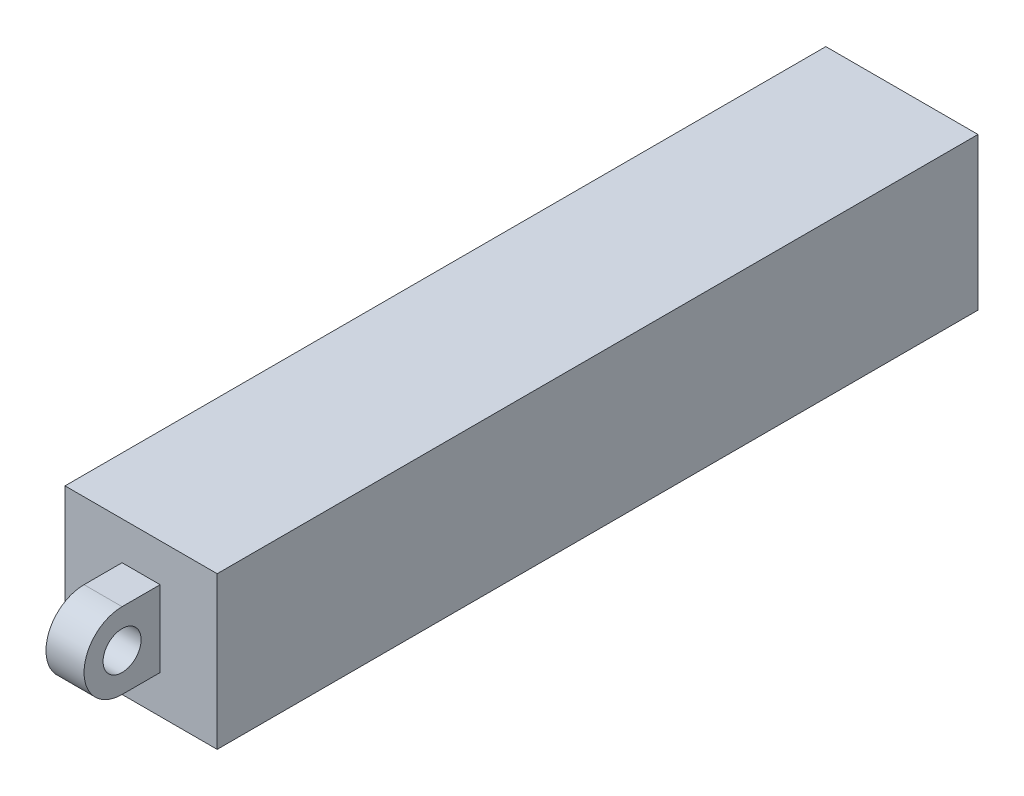
ISO-10303-21;
HEADER;
FILE_DESCRIPTION(('STEP AP214'),'2;1');
FILE_NAME('part.step','',(''),(''),'','','');
FILE_SCHEMA(('AUTOMOTIVE_DESIGN { 1 0 10303 214 1 1 1 1 }'));
ENDSEC;
DATA;
#1=APPLICATION_CONTEXT('core data for automotive mechanical design processes');
#2=APPLICATION_PROTOCOL_DEFINITION('international standard','automotive_design',2000,#1);
#3=PRODUCT_CONTEXT('',#1,'mechanical');
#4=PRODUCT('Part','Part','',(#3));
#5=PRODUCT_RELATED_PRODUCT_CATEGORY('part','',(#4));
#6=PRODUCT_DEFINITION_FORMATION('','',#4);
#7=PRODUCT_DEFINITION_CONTEXT('part definition',#1,'design');
#8=PRODUCT_DEFINITION('design','',#6,#7);
#9=PRODUCT_DEFINITION_SHAPE('','',#8);
#10=(LENGTH_UNIT() NAMED_UNIT(*) SI_UNIT(.MILLI.,.METRE.));
#11=(NAMED_UNIT(*) PLANE_ANGLE_UNIT() SI_UNIT($,.RADIAN.));
#12=(NAMED_UNIT(*) SI_UNIT($,.STERADIAN.) SOLID_ANGLE_UNIT());
#13=UNCERTAINTY_MEASURE_WITH_UNIT(LENGTH_MEASURE(1.E-05),#10,'distance_accuracy_value','');
#14=(GEOMETRIC_REPRESENTATION_CONTEXT(3) GLOBAL_UNCERTAINTY_ASSIGNED_CONTEXT((#13)) GLOBAL_UNIT_ASSIGNED_CONTEXT((#10,
#11,#12)) REPRESENTATION_CONTEXT('',''));
#15=CARTESIAN_POINT('',(0.,0.,0.));
#16=DIRECTION('',(0.,0.,1.));
#17=DIRECTION('',(1.,0.,0.));
#18=AXIS2_PLACEMENT_3D('',#15,#16,#17);
#19=CARTESIAN_POINT('',(5.,5.,25.));
#20=DIRECTION('',(0.,0.,-1.));
#21=DIRECTION('',(-1.,0.,0.));
#22=AXIS2_PLACEMENT_3D('',#19,#20,#21);
#23=PLANE('',#22);
#24=DIRECTION('',(0.,-1.,0.));
#25=VECTOR('',#24,1.);
#26=CARTESIAN_POINT('',(-5.,5.,25.));
#27=LINE('',#26,#25);
#28=CARTESIAN_POINT('',(-5.,5.,25.));
#29=VERTEX_POINT('',#28);
#30=CARTESIAN_POINT('',(-5.,-5.,25.));
#31=VERTEX_POINT('',#30);
#32=EDGE_CURVE('E117',#29,#31,#27,.T.);
#33=ORIENTED_EDGE('',*,*,#32,.T.);
#34=DIRECTION('',(-1.,0.,0.));
#35=VECTOR('',#34,1.);
#36=CARTESIAN_POINT('',(5.,-5.,25.));
#37=LINE('',#36,#35);
#38=CARTESIAN_POINT('',(5.,-5.,25.));
#39=VERTEX_POINT('',#38);
#40=EDGE_CURVE('E11',#39,#31,#37,.T.);
#41=ORIENTED_EDGE('',*,*,#40,.F.);
#42=DIRECTION('',(0.,-1.,0.));
#43=VECTOR('',#42,1.);
#44=CARTESIAN_POINT('',(5.,5.,25.));
#45=LINE('',#44,#43);
#46=CARTESIAN_POINT('',(5.,5.,25.));
#47=VERTEX_POINT('',#46);
#48=EDGE_CURVE('E126',#47,#39,#45,.T.);
#49=ORIENTED_EDGE('',*,*,#48,.F.);
#50=DIRECTION('',(-1.,0.,0.));
#51=VECTOR('',#50,1.);
#52=CARTESIAN_POINT('',(5.,5.,25.));
#53=LINE('',#52,#51);
#54=EDGE_CURVE('E135',#47,#29,#53,.T.);
#55=ORIENTED_EDGE('',*,*,#54,.T.);
#56=EDGE_LOOP('',(#33,#41,#49,#55));
#57=FACE_BOUND('',#56,.T.);
#58=DIRECTION('',(-1.,0.,0.));
#59=VECTOR('',#58,1.);
#60=CARTESIAN_POINT('',(1.25,-2.5,25.));
#61=LINE('',#60,#59);
#62=CARTESIAN_POINT('',(1.25,-2.5,25.));
#63=VERTEX_POINT('',#62);
#64=CARTESIAN_POINT('',(-1.25,-2.5,25.));
#65=VERTEX_POINT('',#64);
#66=EDGE_CURVE('E52',#63,#65,#61,.T.);
#67=ORIENTED_EDGE('',*,*,#66,.T.);
#68=DIRECTION('',(0.,1.,0.));
#69=VECTOR('',#68,1.);
#70=CARTESIAN_POINT('',(-1.25,2.5,25.));
#71=LINE('',#70,#69);
#72=CARTESIAN_POINT('',(-1.25,2.5,25.));
#73=VERTEX_POINT('',#72);
#74=EDGE_CURVE('E216',#65,#73,#71,.T.);
#75=ORIENTED_EDGE('',*,*,#74,.T.);
#76=DIRECTION('',(-1.,0.,0.));
#77=VECTOR('',#76,1.);
#78=CARTESIAN_POINT('',(1.25,2.5,25.));
#79=LINE('',#78,#77);
#80=CARTESIAN_POINT('',(1.25,2.5,25.));
#81=VERTEX_POINT('',#80);
#82=EDGE_CURVE('E122',#81,#73,#79,.T.);
#83=ORIENTED_EDGE('',*,*,#82,.F.);
#84=DIRECTION('',(0.,1.,0.));
#85=VECTOR('',#84,1.);
#86=CARTESIAN_POINT('',(1.25,2.5,25.));
#87=LINE('',#86,#85);
#88=EDGE_CURVE('E47',#63,#81,#87,.T.);
#89=ORIENTED_EDGE('',*,*,#88,.F.);
#90=EDGE_LOOP('',(#67,#75,#83,#89));
#91=FACE_BOUND('',#90,.T.);
#92=ADVANCED_FACE('F33',(#57,#91),#23,.F.);
#93=CARTESIAN_POINT('',(5.,-5.,25.));
#94=DIRECTION('',(0.,1.,0.));
#95=DIRECTION('',(0.,0.,1.));
#96=AXIS2_PLACEMENT_3D('',#93,#94,#95);
#97=PLANE('',#96);
#98=DIRECTION('',(0.,0.,-1.));
#99=VECTOR('',#98,1.);
#100=CARTESIAN_POINT('',(-5.,-5.,25.));
#101=LINE('',#100,#99);
#102=CARTESIAN_POINT('',(-5.,-5.,-25.));
#103=VERTEX_POINT('',#102);
#104=EDGE_CURVE('E120',#31,#103,#101,.T.);
#105=ORIENTED_EDGE('',*,*,#104,.T.);
#106=DIRECTION('',(-1.,0.,0.));
#107=VECTOR('',#106,1.);
#108=CARTESIAN_POINT('',(5.,-5.,-25.));
#109=LINE('',#108,#107);
#110=CARTESIAN_POINT('',(5.,-5.,-25.));
#111=VERTEX_POINT('',#110);
#112=EDGE_CURVE('E40',#111,#103,#109,.T.);
#113=ORIENTED_EDGE('',*,*,#112,.F.);
#114=DIRECTION('',(0.,0.,-1.));
#115=VECTOR('',#114,1.);
#116=CARTESIAN_POINT('',(5.,-5.,25.));
#117=LINE('',#116,#115);
#118=EDGE_CURVE('E129',#39,#111,#117,.T.);
#119=ORIENTED_EDGE('',*,*,#118,.F.);
#120=ORIENTED_EDGE('',*,*,#40,.T.);
#121=EDGE_LOOP('',(#105,#113,#119,#120));
#122=FACE_BOUND('',#121,.T.);
#123=ADVANCED_FACE('F166',(#122),#97,.F.);
#124=CARTESIAN_POINT('',(5.,5.,-25.));
#125=DIRECTION('',(0.,0.,1.));
#126=DIRECTION('',(1.,0.,0.));
#127=AXIS2_PLACEMENT_3D('',#124,#125,#126);
#128=PLANE('',#127);
#129=DIRECTION('',(0.,1.,0.));
#130=VECTOR('',#129,1.);
#131=CARTESIAN_POINT('',(-5.,5.,-25.));
#132=LINE('',#131,#130);
#133=CARTESIAN_POINT('',(-5.,5.,-25.));
#134=VERTEX_POINT('',#133);
#135=EDGE_CURVE('E138',#103,#134,#132,.T.);
#136=ORIENTED_EDGE('',*,*,#135,.T.);
#137=DIRECTION('',(-1.,0.,0.));
#138=VECTOR('',#137,1.);
#139=CARTESIAN_POINT('',(5.,5.,-25.));
#140=LINE('',#139,#138);
#141=CARTESIAN_POINT('',(5.,5.,-25.));
#142=VERTEX_POINT('',#141);
#143=EDGE_CURVE('E143',#142,#134,#140,.T.);
#144=ORIENTED_EDGE('',*,*,#143,.F.);
#145=DIRECTION('',(0.,1.,0.));
#146=VECTOR('',#145,1.);
#147=CARTESIAN_POINT('',(5.,5.,-25.));
#148=LINE('',#147,#146);
#149=EDGE_CURVE('E132',#111,#142,#148,.T.);
#150=ORIENTED_EDGE('',*,*,#149,.F.);
#151=ORIENTED_EDGE('',*,*,#112,.T.);
#152=EDGE_LOOP('',(#136,#144,#150,#151));
#153=FACE_BOUND('',#152,.T.);
#154=ADVANCED_FACE('F150',(#153),#128,.F.);
#155=CARTESIAN_POINT('',(5.,5.,25.));
#156=DIRECTION('',(0.,-1.,0.));
#157=DIRECTION('',(0.,0.,-1.));
#158=AXIS2_PLACEMENT_3D('',#155,#156,#157);
#159=PLANE('',#158);
#160=DIRECTION('',(0.,0.,1.));
#161=VECTOR('',#160,1.);
#162=CARTESIAN_POINT('',(-5.,5.,25.));
#163=LINE('',#162,#161);
#164=EDGE_CURVE('E130',#134,#29,#163,.T.);
#165=ORIENTED_EDGE('',*,*,#164,.T.);
#166=ORIENTED_EDGE('',*,*,#54,.F.);
#167=DIRECTION('',(0.,0.,1.));
#168=VECTOR('',#167,1.);
#169=CARTESIAN_POINT('',(5.,5.,25.));
#170=LINE('',#169,#168);
#171=EDGE_CURVE('E134',#142,#47,#170,.T.);
#172=ORIENTED_EDGE('',*,*,#171,.F.);
#173=ORIENTED_EDGE('',*,*,#143,.T.);
#174=EDGE_LOOP('',(#165,#166,#172,#173));
#175=FACE_BOUND('',#174,.T.);
#176=ADVANCED_FACE('F159',(#175),#159,.F.);
#177=CARTESIAN_POINT('',(5.,0.,0.));
#178=DIRECTION('',(1.,0.,0.));
#179=DIRECTION('',(0.,0.,-1.));
#180=AXIS2_PLACEMENT_3D('',#177,#178,#179);
#181=PLANE('',#180);
#182=ORIENTED_EDGE('',*,*,#48,.T.);
#183=ORIENTED_EDGE('',*,*,#118,.T.);
#184=ORIENTED_EDGE('',*,*,#149,.T.);
#185=ORIENTED_EDGE('',*,*,#171,.T.);
#186=EDGE_LOOP('',(#182,#183,#184,#185));
#187=FACE_BOUND('',#186,.T.);
#188=ADVANCED_FACE('F165',(#187),#181,.T.);
#189=CARTESIAN_POINT('',(-5.,0.,0.));
#190=DIRECTION('',(1.,0.,0.));
#191=DIRECTION('',(0.,0.,-1.));
#192=AXIS2_PLACEMENT_3D('',#189,#190,#191);
#193=PLANE('',#192);
#194=ORIENTED_EDGE('',*,*,#32,.F.);
#195=ORIENTED_EDGE('',*,*,#164,.F.);
#196=ORIENTED_EDGE('',*,*,#135,.F.);
#197=ORIENTED_EDGE('',*,*,#104,.F.);
#198=EDGE_LOOP('',(#194,#195,#196,#197));
#199=FACE_BOUND('',#198,.T.);
#200=ADVANCED_FACE('F156',(#199),#193,.F.);
#201=CARTESIAN_POINT('',(1.25,0.,27.5));
#202=DIRECTION('',(1.,0.,0.));
#203=DIRECTION('',(0.,0.,-1.));
#204=AXIS2_PLACEMENT_3D('',#201,#202,#203);
#205=PLANE('',#204);
#206=CARTESIAN_POINT('',(1.25,0.,27.5));
#207=DIRECTION('',(1.,0.,0.));
#208=DIRECTION('',(0.,0.,-1.));
#209=AXIS2_PLACEMENT_3D('',#206,#207,#208);
#210=CIRCLE('',#209,2.5);
#211=CARTESIAN_POINT('',(1.25,2.5,27.5));
#212=VERTEX_POINT('',#211);
#213=CARTESIAN_POINT('',(1.25,-2.5,27.5));
#214=VERTEX_POINT('',#213);
#215=EDGE_CURVE('E102',#212,#214,#210,.T.);
#216=ORIENTED_EDGE('',*,*,#215,.T.);
#217=DIRECTION('',(0.,0.,-1.));
#218=VECTOR('',#217,1.);
#219=CARTESIAN_POINT('',(1.25,-2.5,27.5));
#220=LINE('',#219,#218);
#221=EDGE_CURVE('E95',#214,#63,#220,.T.);
#222=ORIENTED_EDGE('',*,*,#221,.T.);
#223=ORIENTED_EDGE('',*,*,#88,.T.);
#224=DIRECTION('',(0.,0.,1.));
#225=VECTOR('',#224,1.);
#226=CARTESIAN_POINT('',(1.25,2.5,27.5));
#227=LINE('',#226,#225);
#228=EDGE_CURVE('E108',#81,#212,#227,.T.);
#229=ORIENTED_EDGE('',*,*,#228,.T.);
#230=EDGE_LOOP('',(#216,#222,#223,#229));
#231=FACE_BOUND('',#230,.T.);
#232=CARTESIAN_POINT('',(1.25,0.,27.5));
#233=DIRECTION('',(1.,0.,0.));
#234=DIRECTION('',(0.,0.,-1.));
#235=AXIS2_PLACEMENT_3D('',#232,#233,#234);
#236=CIRCLE('',#235,1.25);
#237=CARTESIAN_POINT('',(1.25,0.,26.25));
#238=VERTEX_POINT('',#237);
#239=EDGE_CURVE('E202',#238,#238,#236,.T.);
#240=ORIENTED_EDGE('',*,*,#239,.F.);
#241=EDGE_LOOP('',(#240));
#242=FACE_BOUND('',#241,.T.);
#243=ADVANCED_FACE('F105',(#231,#242),#205,.T.);
#244=CARTESIAN_POINT('',(-1.25,0.,27.5));
#245=DIRECTION('',(1.,0.,0.));
#246=DIRECTION('',(0.,0.,-1.));
#247=AXIS2_PLACEMENT_3D('',#244,#245,#246);
#248=PLANE('',#247);
#249=CARTESIAN_POINT('',(-1.25,0.,27.5));
#250=DIRECTION('',(1.,0.,0.));
#251=DIRECTION('',(0.,0.,-1.));
#252=AXIS2_PLACEMENT_3D('',#249,#250,#251);
#253=CIRCLE('',#252,2.5);
#254=CARTESIAN_POINT('',(-1.25,2.5,27.5));
#255=VERTEX_POINT('',#254);
#256=CARTESIAN_POINT('',(-1.25,-2.5,27.5));
#257=VERTEX_POINT('',#256);
#258=EDGE_CURVE('E116',#255,#257,#253,.T.);
#259=ORIENTED_EDGE('',*,*,#258,.F.);
#260=DIRECTION('',(0.,0.,1.));
#261=VECTOR('',#260,1.);
#262=CARTESIAN_POINT('',(-1.25,2.5,27.5));
#263=LINE('',#262,#261);
#264=EDGE_CURVE('E112',#73,#255,#263,.T.);
#265=ORIENTED_EDGE('',*,*,#264,.F.);
#266=ORIENTED_EDGE('',*,*,#74,.F.);
#267=DIRECTION('',(0.,0.,-1.));
#268=VECTOR('',#267,1.);
#269=CARTESIAN_POINT('',(-1.25,-2.5,27.5));
#270=LINE('',#269,#268);
#271=EDGE_CURVE('E214',#257,#65,#270,.T.);
#272=ORIENTED_EDGE('',*,*,#271,.F.);
#273=EDGE_LOOP('',(#259,#265,#266,#272));
#274=FACE_BOUND('',#273,.T.);
#275=CARTESIAN_POINT('',(-1.25,0.,27.5));
#276=DIRECTION('',(1.,0.,0.));
#277=DIRECTION('',(0.,0.,-1.));
#278=AXIS2_PLACEMENT_3D('',#275,#276,#277);
#279=CIRCLE('',#278,1.25);
#280=CARTESIAN_POINT('',(-1.25,0.,26.25));
#281=VERTEX_POINT('',#280);
#282=EDGE_CURVE('E205',#281,#281,#279,.T.);
#283=ORIENTED_EDGE('',*,*,#282,.T.);
#284=EDGE_LOOP('',(#283));
#285=FACE_BOUND('',#284,.T.);
#286=ADVANCED_FACE('F182',(#274,#285),#248,.F.);
#287=CARTESIAN_POINT('',(1.25,0.,27.5));
#288=DIRECTION('',(-1.,0.,0.));
#289=DIRECTION('',(0.,0.,1.));
#290=AXIS2_PLACEMENT_3D('',#287,#288,#289);
#291=CYLINDRICAL_SURFACE('',#290,2.5);
#292=ORIENTED_EDGE('',*,*,#258,.T.);
#293=DIRECTION('',(-1.,0.,0.));
#294=VECTOR('',#293,1.);
#295=CARTESIAN_POINT('',(1.25,-2.5,27.5));
#296=LINE('',#295,#294);
#297=EDGE_CURVE('E99',#214,#257,#296,.T.);
#298=ORIENTED_EDGE('',*,*,#297,.F.);
#299=ORIENTED_EDGE('',*,*,#215,.F.);
#300=DIRECTION('',(-1.,0.,0.));
#301=VECTOR('',#300,1.);
#302=CARTESIAN_POINT('',(1.25,2.5,27.5));
#303=LINE('',#302,#301);
#304=EDGE_CURVE('E212',#212,#255,#303,.T.);
#305=ORIENTED_EDGE('',*,*,#304,.T.);
#306=EDGE_LOOP('',(#292,#298,#299,#305));
#307=FACE_BOUND('',#306,.T.);
#308=ADVANCED_FACE('F114',(#307),#291,.T.);
#309=CARTESIAN_POINT('',(1.25,-2.5,27.5));
#310=DIRECTION('',(0.,1.,0.));
#311=DIRECTION('',(0.,0.,1.));
#312=AXIS2_PLACEMENT_3D('',#309,#310,#311);
#313=PLANE('',#312);
#314=ORIENTED_EDGE('',*,*,#271,.T.);
#315=ORIENTED_EDGE('',*,*,#66,.F.);
#316=ORIENTED_EDGE('',*,*,#221,.F.);
#317=ORIENTED_EDGE('',*,*,#297,.T.);
#318=EDGE_LOOP('',(#314,#315,#316,#317));
#319=FACE_BOUND('',#318,.T.);
#320=ADVANCED_FACE('F97',(#319),#313,.F.);
#321=CARTESIAN_POINT('',(1.25,2.5,27.5));
#322=DIRECTION('',(0.,-1.,0.));
#323=DIRECTION('',(0.,0.,-1.));
#324=AXIS2_PLACEMENT_3D('',#321,#322,#323);
#325=PLANE('',#324);
#326=ORIENTED_EDGE('',*,*,#264,.T.);
#327=ORIENTED_EDGE('',*,*,#304,.F.);
#328=ORIENTED_EDGE('',*,*,#228,.F.);
#329=ORIENTED_EDGE('',*,*,#82,.T.);
#330=EDGE_LOOP('',(#326,#327,#328,#329));
#331=FACE_BOUND('',#330,.T.);
#332=ADVANCED_FACE('F185',(#331),#325,.F.);
#333=CARTESIAN_POINT('',(1.25,0.,27.5));
#334=DIRECTION('',(-1.,0.,0.));
#335=DIRECTION('',(0.,0.,1.));
#336=AXIS2_PLACEMENT_3D('',#333,#334,#335);
#337=CYLINDRICAL_SURFACE('',#336,1.25);
#338=ORIENTED_EDGE('',*,*,#239,.T.);
#339=EDGE_LOOP('',(#338));
#340=FACE_BOUND('',#339,.T.);
#341=ORIENTED_EDGE('',*,*,#282,.F.);
#342=EDGE_LOOP('',(#341));
#343=FACE_BOUND('',#342,.T.);
#344=ADVANCED_FACE('F188',(#340,#343),#337,.F.);
#345=CLOSED_SHELL('',(#92,#123,#154,#176,#188,#200,#243,#286,#308,#320,#332,#344));
#346=MANIFOLD_SOLID_BREP('B2',#345);
#347=ADVANCED_BREP_SHAPE_REPRESENTATION('',(#18,#346),#14);
#348=SHAPE_DEFINITION_REPRESENTATION(#9,#347);
ENDSEC;
END-ISO-10303-21;
